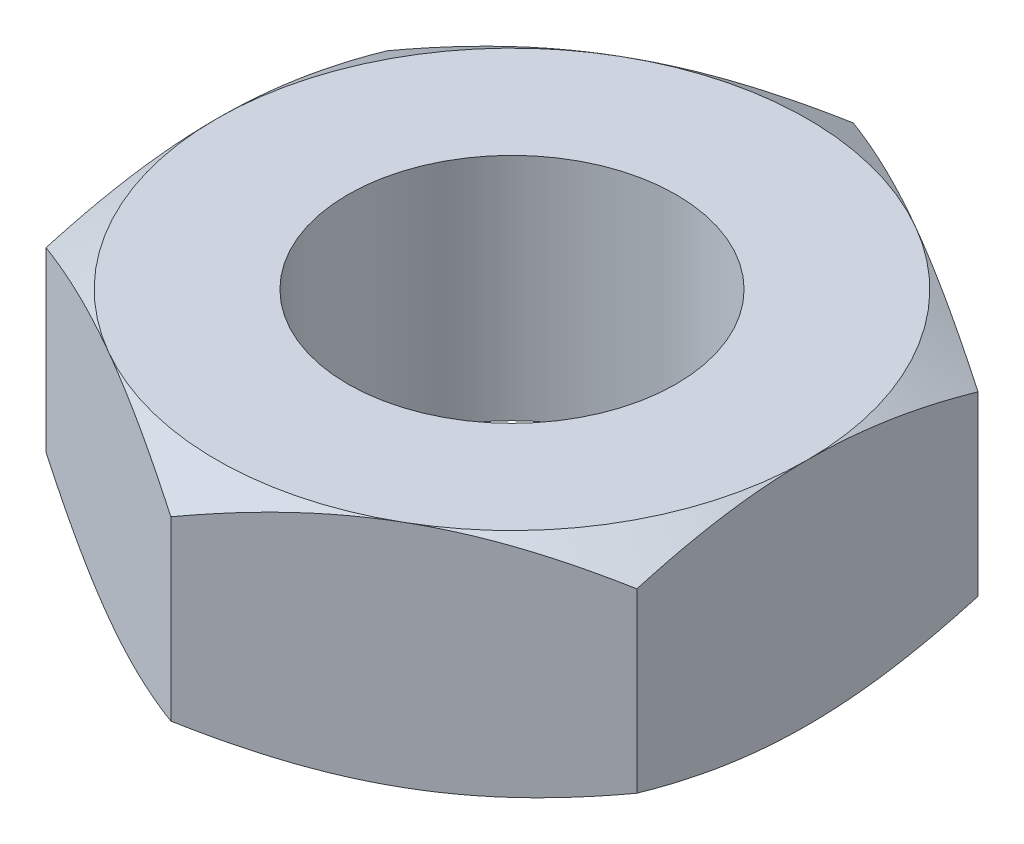
ISO-10303-21;
HEADER;
FILE_DESCRIPTION(('STEP AP214'),'2;1');
FILE_NAME('part.step','',(''),(''),'','','');
FILE_SCHEMA(('AUTOMOTIVE_DESIGN { 1 0 10303 214 1 1 1 1 }'));
ENDSEC;
DATA;
#1=APPLICATION_CONTEXT('core data for automotive mechanical design processes');
#2=APPLICATION_PROTOCOL_DEFINITION('international standard','automotive_design',2000,#1);
#3=PRODUCT_CONTEXT('',#1,'mechanical');
#4=PRODUCT('Part','Part','',(#3));
#5=PRODUCT_RELATED_PRODUCT_CATEGORY('part','',(#4));
#6=PRODUCT_DEFINITION_FORMATION('','',#4);
#7=PRODUCT_DEFINITION_CONTEXT('part definition',#1,'design');
#8=PRODUCT_DEFINITION('design','',#6,#7);
#9=PRODUCT_DEFINITION_SHAPE('','',#8);
#10=(LENGTH_UNIT() NAMED_UNIT(*) SI_UNIT(.MILLI.,.METRE.));
#11=(NAMED_UNIT(*) PLANE_ANGLE_UNIT() SI_UNIT($,.RADIAN.));
#12=(NAMED_UNIT(*) SI_UNIT($,.STERADIAN.) SOLID_ANGLE_UNIT());
#13=UNCERTAINTY_MEASURE_WITH_UNIT(LENGTH_MEASURE(1.E-05),#10,'distance_accuracy_value','');
#14=(GEOMETRIC_REPRESENTATION_CONTEXT(3) GLOBAL_UNCERTAINTY_ASSIGNED_CONTEXT((#13)) GLOBAL_UNIT_ASSIGNED_CONTEXT((#10,
#11,#12)) REPRESENTATION_CONTEXT('',''));
#15=CARTESIAN_POINT('',(0.,0.,0.));
#16=DIRECTION('',(0.,0.,1.));
#17=DIRECTION('',(1.,0.,0.));
#18=AXIS2_PLACEMENT_3D('',#15,#16,#17);
#19=CARTESIAN_POINT('',(0.,0.,0.));
#20=DIRECTION('',(0.,1.,0.));
#21=DIRECTION('',(0.,0.,1.));
#22=AXIS2_PLACEMENT_3D('',#19,#20,#21);
#23=PLANE('',#22);
#24=CARTESIAN_POINT('',(0.,0.,0.));
#25=DIRECTION('',(0.,1.,0.));
#26=DIRECTION('',(0.,0.,1.));
#27=AXIS2_PLACEMENT_3D('',#24,#25,#26);
#28=CIRCLE('',#27,1.25);
#29=CARTESIAN_POINT('',(0.,0.,1.25));
#30=VERTEX_POINT('',#29);
#31=EDGE_CURVE('E277',#30,#30,#28,.T.);
#32=ORIENTED_EDGE('',*,*,#31,.T.);
#33=EDGE_LOOP('',(#32));
#34=FACE_BOUND('',#33,.T.);
#35=CARTESIAN_POINT('',(0.,0.,0.));
#36=DIRECTION('',(0.,1.,0.));
#37=DIRECTION('',(0.,0.,1.));
#38=AXIS2_PLACEMENT_3D('',#35,#36,#37);
#39=CIRCLE('',#38,2.25);
#40=CARTESIAN_POINT('',(1.125,0.,1.94855715851499));
#41=VERTEX_POINT('',#40);
#42=CARTESIAN_POINT('',(-1.125,0.,1.94855715851499));
#43=VERTEX_POINT('',#42);
#44=EDGE_CURVE('E52',#41,#43,#39,.F.);
#45=ORIENTED_EDGE('',*,*,#44,.T.);
#46=CARTESIAN_POINT('',(-2.25,0.,0.));
#47=VERTEX_POINT('',#46);
#48=EDGE_CURVE('E12',#43,#47,#39,.F.);
#49=ORIENTED_EDGE('',*,*,#48,.T.);
#50=CARTESIAN_POINT('',(-1.125,0.,-1.94855715851499));
#51=VERTEX_POINT('',#50);
#52=EDGE_CURVE('E58',#47,#51,#39,.F.);
#53=ORIENTED_EDGE('',*,*,#52,.T.);
#54=CARTESIAN_POINT('',(1.125,0.,-1.94855715851499));
#55=VERTEX_POINT('',#54);
#56=EDGE_CURVE('E398',#51,#55,#39,.F.);
#57=ORIENTED_EDGE('',*,*,#56,.T.);
#58=CARTESIAN_POINT('',(2.25,0.,0.));
#59=VERTEX_POINT('',#58);
#60=EDGE_CURVE('E161',#55,#59,#39,.F.);
#61=ORIENTED_EDGE('',*,*,#60,.T.);
#62=CARTESIAN_POINT('',(0.,0.,0.));
#63=DIRECTION('',(0.,1.,0.));
#64=DIRECTION('',(0.,0.,1.));
#65=AXIS2_PLACEMENT_3D('',#62,#63,#64);
#66=CIRCLE('',#65,2.25);
#67=EDGE_CURVE('E142',#41,#59,#66,.T.);
#68=ORIENTED_EDGE('',*,*,#67,.F.);
#69=EDGE_LOOP('',(#45,#49,#53,#57,#61,#68));
#70=FACE_BOUND('',#69,.T.);
#71=ADVANCED_FACE('F47',(#34,#70),#23,.F.);
#72=CARTESIAN_POINT('',(0.,1.75,0.));
#73=DIRECTION('',(0.,1.,0.));
#74=DIRECTION('',(0.,0.,1.));
#75=AXIS2_PLACEMENT_3D('',#72,#73,#74);
#76=PLANE('',#75);
#77=CARTESIAN_POINT('',(0.,1.75,0.));
#78=DIRECTION('',(0.,1.,0.));
#79=DIRECTION('',(0.,0.,1.));
#80=AXIS2_PLACEMENT_3D('',#77,#78,#79);
#81=CIRCLE('',#80,1.25);
#82=CARTESIAN_POINT('',(0.,1.75,1.25));
#83=VERTEX_POINT('',#82);
#84=EDGE_CURVE('E272',#83,#83,#81,.T.);
#85=ORIENTED_EDGE('',*,*,#84,.F.);
#86=EDGE_LOOP('',(#85));
#87=FACE_BOUND('',#86,.T.);
#88=CARTESIAN_POINT('',(0.,1.75,0.));
#89=DIRECTION('',(0.,1.,0.));
#90=DIRECTION('',(0.,0.,1.));
#91=AXIS2_PLACEMENT_3D('',#88,#89,#90);
#92=CIRCLE('',#91,2.25);
#93=CARTESIAN_POINT('',(-1.125,1.75,1.94855715851499));
#94=VERTEX_POINT('',#93);
#95=CARTESIAN_POINT('',(1.125,1.75,1.94855715851499));
#96=VERTEX_POINT('',#95);
#97=EDGE_CURVE('E334',#94,#96,#92,.T.);
#98=ORIENTED_EDGE('',*,*,#97,.T.);
#99=CARTESIAN_POINT('',(2.25,1.75,0.));
#100=VERTEX_POINT('',#99);
#101=EDGE_CURVE('E337',#96,#100,#92,.T.);
#102=ORIENTED_EDGE('',*,*,#101,.T.);
#103=CARTESIAN_POINT('',(1.125,1.75,-1.94855715851499));
#104=VERTEX_POINT('',#103);
#105=EDGE_CURVE('E349',#100,#104,#92,.T.);
#106=ORIENTED_EDGE('',*,*,#105,.T.);
#107=CARTESIAN_POINT('',(-1.125,1.75,-1.94855715851499));
#108=VERTEX_POINT('',#107);
#109=EDGE_CURVE('E353',#104,#108,#92,.T.);
#110=ORIENTED_EDGE('',*,*,#109,.T.);
#111=CARTESIAN_POINT('',(-2.25,1.75,0.));
#112=VERTEX_POINT('',#111);
#113=EDGE_CURVE('E346',#108,#112,#92,.T.);
#114=ORIENTED_EDGE('',*,*,#113,.T.);
#115=EDGE_CURVE('E339',#112,#94,#92,.T.);
#116=ORIENTED_EDGE('',*,*,#115,.T.);
#117=EDGE_LOOP('',(#98,#102,#106,#110,#114,#116));
#118=FACE_BOUND('',#117,.T.);
#119=ADVANCED_FACE('F315',(#87,#118),#76,.T.);
#120=CARTESIAN_POINT('',(2.25,1.75,-1.29903810567666));
#121=DIRECTION('',(-0.5,0.,0.866025403784439));
#122=DIRECTION('',(0.866025403784439,0.,0.5));
#123=AXIS2_PLACEMENT_3D('',#120,#121,#122);
#124=PLANE('',#123);
#125=DIRECTION('',(0.,-1.,0.));
#126=VECTOR('',#125,1.);
#127=CARTESIAN_POINT('',(2.25,1.75,-1.29903810567666));
#128=LINE('',#127,#126);
#129=CARTESIAN_POINT('',(2.25,1.54903810567666,-1.29903810567667));
#130=VERTEX_POINT('',#129);
#131=CARTESIAN_POINT('',(2.25,0.200961894323341,-1.29903810567666));
#132=VERTEX_POINT('',#131);
#133=EDGE_CURVE('E276',#130,#132,#128,.T.);
#134=ORIENTED_EDGE('',*,*,#133,.T.);
#135=CARTESIAN_POINT('',(2.2502,0.201028565434254,-1.29892263562282));
#136=CARTESIAN_POINT('',(2.15132275118564,0.168055578047864,-1.35600944184252));
#137=CARTESIAN_POINT('',(2.05159200282091,0.138067535415598,-1.41358901625738));
#138=CARTESIAN_POINT('',(1.85040345977937,0.085722388230878,-1.52974527574028));
#139=CARTESIAN_POINT('',(1.74894208949705,0.0633838027064787,-1.58832402518513));
#140=CARTESIAN_POINT('',(1.54727681019892,0.0286095576734189,-1.7047555284741));
#141=CARTESIAN_POINT('',(1.44710393502333,0.0159424738337184,-1.76259036492223));
#142=CARTESIAN_POINT('',(1.24628668739732,0.000818907417419075,-1.87853225689703));
#143=CARTESIAN_POINT('',(1.1456430451668,-0.00165009697600112,-1.93663889083104));
#144=CARTESIAN_POINT('',(0.957574835473434,0.00347837463602968,-2.04522012232352));
#145=CARTESIAN_POINT('',(0.870122156108741,0.00981663451512055,-2.09571095029608));
#146=CARTESIAN_POINT('',(0.695786567891225,0.0299076571898893,-2.19636364908279));
#147=CARTESIAN_POINT('',(0.608904262311711,0.0436672872310839,-2.24652517159694));
#148=CARTESIAN_POINT('',(0.434209045898264,0.0780662653506658,-2.34738550181938));
#149=CARTESIAN_POINT('',(0.346418252564746,0.0988514715826556,-2.39807153998286));
#150=CARTESIAN_POINT('',(0.172146263122404,0.146026087362979,-2.49868751999961));
#151=CARTESIAN_POINT('',(0.0856628332489974,0.172404408014302,-2.54861875151746));
#152=CARTESIAN_POINT('',(-0.000200000000000119,0.201028565434255,-2.59819168140715));
#153=B_SPLINE_CURVE_WITH_KNOTS('',3,(#135,#136,#137,#138,#139,#140,#141,#142,#143,#144,#145,
#146,#147,#148,#149,#150,#151,#152),.UNSPECIFIED.,.F.,.F.,(4,2,2,2,2,2,2,2,4),(0.,
0.356658826016552,0.714175103224236,1.06284241804968,1.41108149062516,1.71433394539794,
2.01786749258222,2.32813511279245,2.63779325460359),.UNSPECIFIED.);
#154=EDGE_CURVE('E71',#132,#55,#153,.T.);
#155=ORIENTED_EDGE('',*,*,#154,.T.);
#156=CARTESIAN_POINT('',(0.,0.200961894323341,-2.59807621135332));
#157=VERTEX_POINT('',#156);
#158=EDGE_CURVE('E206',#55,#157,#153,.T.);
#159=ORIENTED_EDGE('',*,*,#158,.T.);
#160=DIRECTION('',(0.,-1.,0.));
#161=VECTOR('',#160,1.);
#162=CARTESIAN_POINT('',(0.,1.75,-2.59807621135332));
#163=LINE('',#162,#161);
#164=CARTESIAN_POINT('',(0.,1.54903810567666,-2.59807621135332));
#165=VERTEX_POINT('',#164);
#166=EDGE_CURVE('E297',#165,#157,#163,.T.);
#167=ORIENTED_EDGE('',*,*,#166,.F.);
#168=CARTESIAN_POINT('',(2.2502,1.54897143456575,-1.29892263562282));
#169=CARTESIAN_POINT('',(2.15132275118564,1.58194442195214,-1.35600944184252));
#170=CARTESIAN_POINT('',(2.05159200282091,1.6119324645844,-1.41358901625738));
#171=CARTESIAN_POINT('',(1.85040345977937,1.66427761176912,-1.52974527574029));
#172=CARTESIAN_POINT('',(1.74894208949705,1.68661619729352,-1.58832402518513));
#173=CARTESIAN_POINT('',(1.54727681019892,1.72139044232658,-1.7047555284741));
#174=CARTESIAN_POINT('',(1.44710393502333,1.73405752616628,-1.76259036492223));
#175=CARTESIAN_POINT('',(1.24628668739732,1.74918109258258,-1.87853225689703));
#176=CARTESIAN_POINT('',(1.1456430451668,1.751650096976,-1.93663889083104));
#177=CARTESIAN_POINT('',(0.957574835473434,1.74652162536397,-2.04522012232352));
#178=CARTESIAN_POINT('',(0.870122156108741,1.74018336548488,-2.09571095029608));
#179=CARTESIAN_POINT('',(0.695786567891225,1.72009234281011,-2.19636364908279));
#180=CARTESIAN_POINT('',(0.608904262311711,1.70633271276892,-2.24652517159694));
#181=CARTESIAN_POINT('',(0.434209045898264,1.67193373464933,-2.34738550181938));
#182=CARTESIAN_POINT('',(0.346418252564746,1.65114852841734,-2.39807153998286));
#183=CARTESIAN_POINT('',(0.172146263122404,1.60397391263702,-2.49868751999961));
#184=CARTESIAN_POINT('',(0.0856628332489972,1.5775955919857,-2.54861875151746));
#185=CARTESIAN_POINT('',(-0.000200000000000122,1.54897143456575,-2.59819168140715));
#186=B_SPLINE_CURVE_WITH_KNOTS('',3,(#168,#169,#170,#171,#172,#173,#174,#175,#176,#177,#178,
#179,#180,#181,#182,#183,#184,#185),.UNSPECIFIED.,.F.,.F.,(4,2,2,2,2,2,2,2,4),(0.,
0.356658826016552,0.714175103224236,1.06284241804968,1.41108149062516,1.71433394539794,
2.01786749258222,2.32813511279245,2.63779325460359),.UNSPECIFIED.);
#187=EDGE_CURVE('E264',#104,#165,#186,.T.);
#188=ORIENTED_EDGE('',*,*,#187,.F.);
#189=EDGE_CURVE('E271',#130,#104,#186,.T.);
#190=ORIENTED_EDGE('',*,*,#189,.F.);
#191=EDGE_LOOP('',(#134,#155,#159,#167,#188,#190));
#192=FACE_BOUND('',#191,.T.);
#193=ADVANCED_FACE('F49',(#192),#124,.F.);
#194=CARTESIAN_POINT('',(0.,1.75,-2.59807621135332));
#195=DIRECTION('',(0.5,0.,0.866025403784439));
#196=DIRECTION('',(0.866025403784439,0.,-0.5));
#197=AXIS2_PLACEMENT_3D('',#194,#195,#196);
#198=PLANE('',#197);
#199=ORIENTED_EDGE('',*,*,#166,.T.);
#200=CARTESIAN_POINT('',(0.000200000000000053,0.201028565434255,-2.59819168140715));
#201=CARTESIAN_POINT('',(-0.0986772488143574,0.168055578047864,-2.54110487518745));
#202=CARTESIAN_POINT('',(-0.198407997179094,0.138067535415598,-2.48352530077259));
#203=CARTESIAN_POINT('',(-0.399596540220633,0.085722388230878,-2.36736904128969));
#204=CARTESIAN_POINT('',(-0.501057910502945,0.0633838027064787,-2.30879029184485));
#205=CARTESIAN_POINT('',(-0.702723189801079,0.0286095576734188,-2.19235878855587));
#206=CARTESIAN_POINT('',(-0.802896064976672,0.0159424738337182,-2.13452395210774));
#207=CARTESIAN_POINT('',(-1.00371331260268,0.000818907417418789,-2.01858206013295));
#208=CARTESIAN_POINT('',(-1.1043569548332,-0.00165009697600148,-1.96047542619893));
#209=CARTESIAN_POINT('',(-1.29242516452656,0.00347837463602929,-1.85189419470646));
#210=CARTESIAN_POINT('',(-1.37987784389126,0.0098166345151202,-1.8014033667339));
#211=CARTESIAN_POINT('',(-1.55421343210877,0.0299076571898889,-1.70075066794718));
#212=CARTESIAN_POINT('',(-1.64109573768829,0.0436672872310835,-1.65058914543304));
#213=CARTESIAN_POINT('',(-1.81579095410174,0.0780662653506654,-1.54972881521059));
#214=CARTESIAN_POINT('',(-1.90358174743525,0.0988514715826553,-1.49904277704711));
#215=CARTESIAN_POINT('',(-2.07785373687759,0.146026087362979,-1.39842679703037));
#216=CARTESIAN_POINT('',(-2.164337166751,0.172404408014302,-1.34849556551251));
#217=CARTESIAN_POINT('',(-2.2502,0.201028565434254,-1.29892263562282));
#218=B_SPLINE_CURVE_WITH_KNOTS('',3,(#200,#201,#202,#203,#204,#205,#206,#207,#208,#209,#210,
#211,#212,#213,#214,#215,#216,#217),.UNSPECIFIED.,.F.,.F.,(4,2,2,2,2,2,2,2,4),(0.,
0.356658826016552,0.714175103224236,1.06284241804968,1.41108149062516,1.71433394539794,
2.01786749258222,2.32813511279245,2.63779325460359),.UNSPECIFIED.);
#219=EDGE_CURVE('E404',#157,#51,#218,.T.);
#220=ORIENTED_EDGE('',*,*,#219,.T.);
#221=CARTESIAN_POINT('',(-2.25,0.200961894323341,-1.29903810567666));
#222=VERTEX_POINT('',#221);
#223=EDGE_CURVE('E225',#51,#222,#218,.T.);
#224=ORIENTED_EDGE('',*,*,#223,.T.);
#225=DIRECTION('',(0.,-1.,0.));
#226=VECTOR('',#225,1.);
#227=CARTESIAN_POINT('',(-2.25,1.75,-1.29903810567666));
#228=LINE('',#227,#226);
#229=CARTESIAN_POINT('',(-2.25,1.54903810567666,-1.29903810567666));
#230=VERTEX_POINT('',#229);
#231=EDGE_CURVE('E293',#230,#222,#228,.T.);
#232=ORIENTED_EDGE('',*,*,#231,.F.);
#233=CARTESIAN_POINT('',(0.000200000000000038,1.54897143456575,-2.59819168140715));
#234=CARTESIAN_POINT('',(-0.0986772488143574,1.58194442195214,-2.54110487518746));
#235=CARTESIAN_POINT('',(-0.198407997179094,1.6119324645844,-2.48352530077259));
#236=CARTESIAN_POINT('',(-0.399596540220633,1.66427761176912,-2.36736904128969));
#237=CARTESIAN_POINT('',(-0.501057910502945,1.68661619729352,-2.30879029184485));
#238=CARTESIAN_POINT('',(-0.702723189801079,1.72139044232658,-2.19235878855587));
#239=CARTESIAN_POINT('',(-0.802896064976672,1.73405752616628,-2.13452395210774));
#240=CARTESIAN_POINT('',(-1.00371331260268,1.74918109258258,-2.01858206013295));
#241=CARTESIAN_POINT('',(-1.1043569548332,1.751650096976,-1.96047542619893));
#242=CARTESIAN_POINT('',(-1.29242516452656,1.74652162536397,-1.85189419470646));
#243=CARTESIAN_POINT('',(-1.37987784389126,1.74018336548488,-1.8014033667339));
#244=CARTESIAN_POINT('',(-1.55421343210877,1.72009234281011,-1.70075066794718));
#245=CARTESIAN_POINT('',(-1.64109573768829,1.70633271276892,-1.65058914543304));
#246=CARTESIAN_POINT('',(-1.81579095410174,1.67193373464933,-1.54972881521059));
#247=CARTESIAN_POINT('',(-1.90358174743525,1.65114852841734,-1.49904277704711));
#248=CARTESIAN_POINT('',(-2.07785373687759,1.60397391263702,-1.39842679703037));
#249=CARTESIAN_POINT('',(-2.164337166751,1.5775955919857,-1.34849556551251));
#250=CARTESIAN_POINT('',(-2.2502,1.54897143456575,-1.29892263562282));
#251=B_SPLINE_CURVE_WITH_KNOTS('',3,(#233,#234,#235,#236,#237,#238,#239,#240,#241,#242,#243,
#244,#245,#246,#247,#248,#249,#250),.UNSPECIFIED.,.F.,.F.,(4,2,2,2,2,2,2,2,4),(0.,
0.356658826016552,0.714175103224236,1.06284241804968,1.41108149062516,1.71433394539794,
2.01786749258222,2.32813511279245,2.63779325460359),.UNSPECIFIED.);
#252=EDGE_CURVE('E256',#108,#230,#251,.T.);
#253=ORIENTED_EDGE('',*,*,#252,.F.);
#254=EDGE_CURVE('E263',#165,#108,#251,.T.);
#255=ORIENTED_EDGE('',*,*,#254,.F.);
#256=EDGE_LOOP('',(#199,#220,#224,#232,#253,#255));
#257=FACE_BOUND('',#256,.T.);
#258=ADVANCED_FACE('F234',(#257),#198,.F.);
#259=CARTESIAN_POINT('',(-2.25,1.75,-1.29903810567666));
#260=DIRECTION('',(1.,0.,0.));
#261=DIRECTION('',(0.,0.,-1.));
#262=AXIS2_PLACEMENT_3D('',#259,#260,#261);
#263=PLANE('',#262);
#264=ORIENTED_EDGE('',*,*,#231,.T.);
#265=CARTESIAN_POINT('',(-2.25,1.57049861982334,-4.43172912721208));
#266=CARTESIAN_POINT('',(-2.25,1.51735693759208,-4.32848794492226));
#267=CARTESIAN_POINT('',(-2.25,1.46450484743296,-4.22509639331572));
#268=CARTESIAN_POINT('',(-2.25,1.35952530789621,-4.01794384416323));
#269=CARTESIAN_POINT('',(-2.25,1.30739787204856,-3.91418283976455));
#270=CARTESIAN_POINT('',(-2.25,1.20393081844307,-3.70605700815303));
#271=CARTESIAN_POINT('',(-2.25,1.1525926236047,-3.60169147231438));
#272=CARTESIAN_POINT('',(-2.25,1.05099117669964,-3.39243582155596));
#273=CARTESIAN_POINT('',(-2.25,1.000727939927,-3.28754569919877));
#274=CARTESIAN_POINT('',(-2.25,0.898925995293034,-3.07160047020285));
#275=CARTESIAN_POINT('',(-2.25,0.847459290612845,-2.96051132352861));
#276=CARTESIAN_POINT('',(-2.25,0.746406212005017,-2.73748183196732));
#277=CARTESIAN_POINT('',(-2.25,0.696819787356086,-2.62554151013899));
#278=CARTESIAN_POINT('',(-2.25,0.600100967453589,-2.40069008962636));
#279=CARTESIAN_POINT('',(-2.25,0.552966929054416,-2.28777970157739));
#280=CARTESIAN_POINT('',(-2.25,0.461846511068629,-2.06065851247683));
#281=CARTESIAN_POINT('',(-2.25,0.417860865336628,-1.94644741538902));
#282=CARTESIAN_POINT('',(-2.25,0.32729368556671,-1.69797138865069));
#283=CARTESIAN_POINT('',(-2.25,0.28143501613463,-1.56343919862733));
#284=CARTESIAN_POINT('',(-2.25,0.197475070529799,-1.29200018214826));
#285=CARTESIAN_POINT('',(-2.25,0.159369866726331,-1.15509459630545));
#286=CARTESIAN_POINT('',(-2.25,0.0942889667848675,-0.881369269399069));
#287=CARTESIAN_POINT('',(-2.25,0.0671140468085098,-0.74459812693742));
#288=CARTESIAN_POINT('',(-2.25,0.0257222330991208,-0.46908644568122));
#289=CARTESIAN_POINT('',(-2.25,0.0114977452462127,-0.3303471095752));
#290=CARTESIAN_POINT('',(-2.25,0.00123269639131357,-0.120784370517542));
#291=CARTESIAN_POINT('',(-2.25,-0.000315601094854738,-0.0502039746349318));
#292=CARTESIAN_POINT('',(-2.25,0.000422033997696976,0.0909367469657726));
#293=CARTESIAN_POINT('',(-2.25,0.00270796730213806,0.161497072680065));
#294=CARTESIAN_POINT('',(-2.25,0.0152377813490387,0.37286438362323));
#295=CARTESIAN_POINT('',(-2.25,0.031153514657774,0.513361084144873));
#296=CARTESIAN_POINT('',(-2.25,0.0764279690031744,0.794982413158732));
#297=CARTESIAN_POINT('',(-2.25,0.106052731323689,0.936062007316042));
#298=CARTESIAN_POINT('',(-2.25,0.175669429631058,1.21561548141805));
#299=CARTESIAN_POINT('',(-2.25,0.215664560549491,1.35408854420889));
#300=CARTESIAN_POINT('',(-2.25,0.301433813240795,1.62298376559588));
#301=CARTESIAN_POINT('',(-2.25,0.34690627294026,1.75350414338493));
#302=CARTESIAN_POINT('',(-2.25,0.442941824020628,2.01267340913791));
#303=CARTESIAN_POINT('',(-2.25,0.493506146306572,2.14132183593333));
#304=CARTESIAN_POINT('',(-2.25,0.598415917250672,2.3972089614727));
#305=CARTESIAN_POINT('',(-2.25,0.652765191067168,2.5244460788882));
#306=CARTESIAN_POINT('',(-2.25,0.764244038829299,2.77769813848635));
#307=CARTESIAN_POINT('',(-2.25,0.821373763792894,2.9037130138371));
#308=CARTESIAN_POINT('',(-2.25,0.934436062749625,3.1476496239965));
#309=CARTESIAN_POINT('',(-2.25,0.990252927298656,3.26562520727676));
#310=CARTESIAN_POINT('',(-2.25,1.10334942732948,3.50087634814471));
#311=CARTESIAN_POINT('',(-2.25,1.16062911044141,3.61815188278466));
#312=CARTESIAN_POINT('',(-2.25,1.27615326827056,3.85174791850404));
#313=CARTESIAN_POINT('',(-2.25,1.3343939714757,3.96807028911018));
#314=CARTESIAN_POINT('',(-2.25,1.45180296105985,4.20023381118101));
#315=CARTESIAN_POINT('',(-2.25,1.51097116762094,4.31607500298083));
#316=CARTESIAN_POINT('',(-2.25,1.57049861982334,4.43172912721207));
#317=B_SPLINE_CURVE_WITH_KNOTS('',3,(#265,#266,#267,#268,#269,#270,#271,#272,#273,#274,#275,
#276,#277,#278,#279,#280,#281,#282,#283,#284,#285,#286,#287,#288,#289,#290,#291,#292,#293,#294,
#295,#296,#297,#298,#299,#300,#301,#302,#303,#304,#305,#306,#307,#308,#309,#310,#311,#312,#313,
#314,#315,#316),.UNSPECIFIED.,.F.,.F.,(4,2,2,2,2,2,2,2,2,2,2,2,2,2,2,2,2,2,2,2,2,2,2,2,2,4),(0.,
0.348347395383933,0.696701286027883,1.04562309484171,1.39454986466947,1.76183249981756,
2.12910522031385,2.49612860556298,2.86323726307789,3.2894710608127,3.71548840311863,
4.13334452619794,4.55095546076511,4.7626532574073,4.97435109411843,5.39773666667532,
5.82970728415092,6.26181114277156,6.67631854142574,7.09092638459783,7.50595949709433,
7.9210151769911,8.31254332110152,8.70408422986847,9.09434358465051,9.4845695373743),.UNSPECIFIED.);
#318=EDGE_CURVE('E224',#222,#47,#317,.T.);
#319=ORIENTED_EDGE('',*,*,#318,.T.);
#320=CARTESIAN_POINT('',(-2.25,0.20096189432334,1.29903810567666));
#321=VERTEX_POINT('',#320);
#322=EDGE_CURVE('E216',#47,#321,#317,.T.);
#323=ORIENTED_EDGE('',*,*,#322,.T.);
#324=DIRECTION('',(0.,-1.,0.));
#325=VECTOR('',#324,1.);
#326=CARTESIAN_POINT('',(-2.25,1.75,1.29903810567666));
#327=LINE('',#326,#325);
#328=CARTESIAN_POINT('',(-2.25,1.54903810567666,1.29903810567666));
#329=VERTEX_POINT('',#328);
#330=EDGE_CURVE('E289',#329,#321,#327,.T.);
#331=ORIENTED_EDGE('',*,*,#330,.F.);
#332=CARTESIAN_POINT('',(-2.25,0.17950138017666,-4.43172912721208));
#333=CARTESIAN_POINT('',(-2.25,0.232643062407916,-4.32848794492226));
#334=CARTESIAN_POINT('',(-2.25,0.285495152567039,-4.22509639331572));
#335=CARTESIAN_POINT('',(-2.25,0.390474692103788,-4.01794384416323));
#336=CARTESIAN_POINT('',(-2.25,0.442602127951439,-3.91418283976455));
#337=CARTESIAN_POINT('',(-2.25,0.546069181556928,-3.70605700815303));
#338=CARTESIAN_POINT('',(-2.25,0.597407376395302,-3.60169147231438));
#339=CARTESIAN_POINT('',(-2.25,0.699008823300362,-3.39243582155596));
#340=CARTESIAN_POINT('',(-2.25,0.749272060072999,-3.28754569919877));
#341=CARTESIAN_POINT('',(-2.25,0.851074004706966,-3.07160047020285));
#342=CARTESIAN_POINT('',(-2.25,0.902540709387155,-2.96051132352861));
#343=CARTESIAN_POINT('',(-2.25,1.00359378799498,-2.73748183196732));
#344=CARTESIAN_POINT('',(-2.25,1.05318021264391,-2.62554151013899));
#345=CARTESIAN_POINT('',(-2.25,1.14989903254641,-2.40069008962636));
#346=CARTESIAN_POINT('',(-2.25,1.19703307094558,-2.28777970157739));
#347=CARTESIAN_POINT('',(-2.25,1.28815348893137,-2.06065851247683));
#348=CARTESIAN_POINT('',(-2.25,1.33213913466337,-1.94644741538902));
#349=CARTESIAN_POINT('',(-2.25,1.42270631443329,-1.69797138865069));
#350=CARTESIAN_POINT('',(-2.25,1.46856498386537,-1.56343919862733));
#351=CARTESIAN_POINT('',(-2.25,1.5525249294702,-1.29200018214826));
#352=CARTESIAN_POINT('',(-2.25,1.59063013327367,-1.15509459630545));
#353=CARTESIAN_POINT('',(-2.25,1.65571103321513,-0.881369269399069));
#354=CARTESIAN_POINT('',(-2.25,1.68288595319149,-0.744598126937421));
#355=CARTESIAN_POINT('',(-2.25,1.72427776690088,-0.469086445681221));
#356=CARTESIAN_POINT('',(-2.25,1.73850225475379,-0.3303471095752));
#357=CARTESIAN_POINT('',(-2.25,1.74876730360869,-0.120784370517543));
#358=CARTESIAN_POINT('',(-2.25,1.75031560109485,-0.0502039746349324));
#359=CARTESIAN_POINT('',(-2.25,1.7495779660023,0.090936746965772));
#360=CARTESIAN_POINT('',(-2.25,1.74729203269786,0.161497072680065));
#361=CARTESIAN_POINT('',(-2.25,1.73476221865096,0.37286438362323));
#362=CARTESIAN_POINT('',(-2.25,1.71884648534223,0.513361084144873));
#363=CARTESIAN_POINT('',(-2.25,1.67357203099683,0.794982413158732));
#364=CARTESIAN_POINT('',(-2.25,1.64394726867631,0.936062007316042));
#365=CARTESIAN_POINT('',(-2.25,1.57433057036894,1.21561548141805));
#366=CARTESIAN_POINT('',(-2.25,1.53433543945051,1.35408854420889));
#367=CARTESIAN_POINT('',(-2.25,1.44856618675921,1.62298376559588));
#368=CARTESIAN_POINT('',(-2.25,1.40309372705974,1.75350414338493));
#369=CARTESIAN_POINT('',(-2.25,1.30705817597937,2.01267340913791));
#370=CARTESIAN_POINT('',(-2.25,1.25649385369343,2.14132183593333));
#371=CARTESIAN_POINT('',(-2.25,1.15158408274933,2.3972089614727));
#372=CARTESIAN_POINT('',(-2.25,1.09723480893283,2.5244460788882));
#373=CARTESIAN_POINT('',(-2.25,0.985755961170701,2.77769813848635));
#374=CARTESIAN_POINT('',(-2.25,0.928626236207107,2.9037130138371));
#375=CARTESIAN_POINT('',(-2.25,0.815563937250375,3.1476496239965));
#376=CARTESIAN_POINT('',(-2.25,0.759747072701344,3.26562520727676));
#377=CARTESIAN_POINT('',(-2.25,0.646650572670523,3.50087634814471));
#378=CARTESIAN_POINT('',(-2.25,0.589370889558594,3.61815188278466));
#379=CARTESIAN_POINT('',(-2.25,0.473846731729442,3.85174791850404));
#380=CARTESIAN_POINT('',(-2.25,0.415606028524301,3.96807028911018));
#381=CARTESIAN_POINT('',(-2.25,0.298197038940152,4.20023381118101));
#382=CARTESIAN_POINT('',(-2.25,0.239028832379064,4.31607500298083));
#383=CARTESIAN_POINT('',(-2.25,0.17950138017666,4.43172912721207));
#384=B_SPLINE_CURVE_WITH_KNOTS('',3,(#332,#333,#334,#335,#336,#337,#338,#339,#340,#341,#342,
#343,#344,#345,#346,#347,#348,#349,#350,#351,#352,#353,#354,#355,#356,#357,#358,#359,#360,#361,
#362,#363,#364,#365,#366,#367,#368,#369,#370,#371,#372,#373,#374,#375,#376,#377,#378,#379,#380,
#381,#382,#383),.UNSPECIFIED.,.F.,.F.,(4,2,2,2,2,2,2,2,2,2,2,2,2,2,2,2,2,2,2,2,2,2,2,2,2,4),(0.,
0.348347395383933,0.696701286027883,1.04562309484171,1.39454986466947,1.76183249981756,
2.12910522031385,2.49612860556298,2.86323726307789,3.2894710608127,3.71548840311863,
4.13334452619794,4.55095546076511,4.7626532574073,4.97435109411843,5.39773666667532,
5.82970728415092,6.26181114277156,6.67631854142574,7.09092638459783,7.50595949709433,
7.9210151769911,8.31254332110152,8.70408422986847,9.09434358465051,9.4845695373743),.UNSPECIFIED.);
#385=EDGE_CURVE('E240',#112,#329,#384,.T.);
#386=ORIENTED_EDGE('',*,*,#385,.F.);
#387=EDGE_CURVE('E248',#230,#112,#384,.T.);
#388=ORIENTED_EDGE('',*,*,#387,.F.);
#389=EDGE_LOOP('',(#264,#319,#323,#331,#386,#388));
#390=FACE_BOUND('',#389,.T.);
#391=ADVANCED_FACE('F230',(#390),#263,.F.);
#392=CARTESIAN_POINT('',(-2.25,1.75,1.29903810567666));
#393=DIRECTION('',(0.5,0.,-0.866025403784439));
#394=DIRECTION('',(-0.866025403784439,0.,-0.5));
#395=AXIS2_PLACEMENT_3D('',#392,#393,#394);
#396=PLANE('',#395);
#397=ORIENTED_EDGE('',*,*,#330,.T.);
#398=CARTESIAN_POINT('',(-2.2502,0.201028565434254,1.29892263562282));
#399=CARTESIAN_POINT('',(-2.15132275118564,0.168055578047863,1.35600944184252));
#400=CARTESIAN_POINT('',(-2.05159200282091,0.138067535415598,1.41358901625738));
#401=CARTESIAN_POINT('',(-1.85040345977937,0.0857223882308776,1.52974527574028));
#402=CARTESIAN_POINT('',(-1.74894208949705,0.0633838027064783,1.58832402518512));
#403=CARTESIAN_POINT('',(-1.54727681019892,0.0286095576734184,1.7047555284741));
#404=CARTESIAN_POINT('',(-1.44710393502333,0.0159424738337179,1.76259036492223));
#405=CARTESIAN_POINT('',(-1.24628668739732,0.000818907417418356,1.87853225689702));
#406=CARTESIAN_POINT('',(-1.1456430451668,-0.00165009697600204,1.93663889083104));
#407=CARTESIAN_POINT('',(-0.957574835473434,0.00347837463602872,2.04522012232352));
#408=CARTESIAN_POINT('',(-0.870122156108741,0.00981663451511971,2.09571095029608));
#409=CARTESIAN_POINT('',(-0.695786567891225,0.0299076571898885,2.19636364908279));
#410=CARTESIAN_POINT('',(-0.608904262311711,0.0436672872310832,2.24652517159694));
#411=CARTESIAN_POINT('',(-0.434209045898263,0.0780662653506651,2.34738550181938));
#412=CARTESIAN_POINT('',(-0.346418252564746,0.098851471582655,2.39807153998286));
#413=CARTESIAN_POINT('',(-0.172146263122404,0.146026087362979,2.49868751999961));
#414=CARTESIAN_POINT('',(-0.0856628332489966,0.172404408014301,2.54861875151746));
#415=CARTESIAN_POINT('',(0.00020000000000111,0.201028565434254,2.59819168140715));
#416=B_SPLINE_CURVE_WITH_KNOTS('',3,(#398,#399,#400,#401,#402,#403,#404,#405,#406,#407,#408,
#409,#410,#411,#412,#413,#414,#415),.UNSPECIFIED.,.F.,.F.,(4,2,2,2,2,2,2,2,4),(0.,
0.356658826016552,0.714175103224236,1.06284241804968,1.41108149062516,1.71433394539794,
2.01786749258222,2.32813511279245,2.63779325460359),.UNSPECIFIED.);
#417=EDGE_CURVE('E174',#321,#43,#416,.T.);
#418=ORIENTED_EDGE('',*,*,#417,.T.);
#419=CARTESIAN_POINT('',(0.,0.20096189432334,2.59807621135332));
#420=VERTEX_POINT('',#419);
#421=EDGE_CURVE('E157',#43,#420,#416,.T.);
#422=ORIENTED_EDGE('',*,*,#421,.T.);
#423=DIRECTION('',(0.,-1.,0.));
#424=VECTOR('',#423,1.);
#425=CARTESIAN_POINT('',(0.,1.75,2.59807621135332));
#426=LINE('',#425,#424);
#427=CARTESIAN_POINT('',(0.,1.54903810567666,2.59807621135332));
#428=VERTEX_POINT('',#427);
#429=EDGE_CURVE('E171',#428,#420,#426,.T.);
#430=ORIENTED_EDGE('',*,*,#429,.F.);
#431=CARTESIAN_POINT('',(-2.2502,1.54897143456575,1.29892263562282));
#432=CARTESIAN_POINT('',(-2.15132275118564,1.58194442195214,1.35600944184252));
#433=CARTESIAN_POINT('',(-2.05159200282091,1.6119324645844,1.41358901625738));
#434=CARTESIAN_POINT('',(-1.85040345977937,1.66427761176912,1.52974527574028));
#435=CARTESIAN_POINT('',(-1.74894208949705,1.68661619729352,1.58832402518512));
#436=CARTESIAN_POINT('',(-1.54727681019892,1.72139044232658,1.7047555284741));
#437=CARTESIAN_POINT('',(-1.44710393502333,1.73405752616628,1.76259036492223));
#438=CARTESIAN_POINT('',(-1.24628668739732,1.74918109258258,1.87853225689702));
#439=CARTESIAN_POINT('',(-1.1456430451668,1.751650096976,1.93663889083104));
#440=CARTESIAN_POINT('',(-0.957574835473434,1.74652162536397,2.04522012232352));
#441=CARTESIAN_POINT('',(-0.870122156108741,1.74018336548488,2.09571095029608));
#442=CARTESIAN_POINT('',(-0.695786567891225,1.72009234281011,2.19636364908279));
#443=CARTESIAN_POINT('',(-0.608904262311711,1.70633271276892,2.24652517159694));
#444=CARTESIAN_POINT('',(-0.434209045898263,1.67193373464934,2.34738550181938));
#445=CARTESIAN_POINT('',(-0.346418252564746,1.65114852841735,2.39807153998286));
#446=CARTESIAN_POINT('',(-0.172146263122404,1.60397391263702,2.49868751999961));
#447=CARTESIAN_POINT('',(-0.0856628332489969,1.5775955919857,2.54861875151746));
#448=CARTESIAN_POINT('',(0.000200000000001108,1.54897143456575,2.59819168140715));
#449=B_SPLINE_CURVE_WITH_KNOTS('',3,(#431,#432,#433,#434,#435,#436,#437,#438,#439,#440,#441,
#442,#443,#444,#445,#446,#447,#448),.UNSPECIFIED.,.F.,.F.,(4,2,2,2,2,2,2,2,4),(0.,
0.356658826016552,0.714175103224236,1.06284241804968,1.41108149062516,1.71433394539794,
2.01786749258222,2.32813511279245,2.63779325460359),.UNSPECIFIED.);
#450=EDGE_CURVE('E250',#94,#428,#449,.T.);
#451=ORIENTED_EDGE('',*,*,#450,.F.);
#452=EDGE_CURVE('E249',#329,#94,#449,.T.);
#453=ORIENTED_EDGE('',*,*,#452,.F.);
#454=EDGE_LOOP('',(#397,#418,#422,#430,#451,#453));
#455=FACE_BOUND('',#454,.T.);
#456=ADVANCED_FACE('F233',(#455),#396,.F.);
#457=CARTESIAN_POINT('',(0.,1.75,2.59807621135332));
#458=DIRECTION('',(-0.5,0.,-0.866025403784439));
#459=DIRECTION('',(-0.866025403784439,0.,0.5));
#460=AXIS2_PLACEMENT_3D('',#457,#458,#459);
#461=PLANE('',#460);
#462=ORIENTED_EDGE('',*,*,#429,.T.);
#463=CARTESIAN_POINT('',(-0.000199999999999119,0.201028565434254,2.59819168140715));
#464=CARTESIAN_POINT('',(0.0986772488143582,0.168055578047863,2.54110487518745));
#465=CARTESIAN_POINT('',(0.198407997179094,0.138067535415598,2.48352530077259));
#466=CARTESIAN_POINT('',(0.399596540220634,0.0857223882308776,2.36736904128969));
#467=CARTESIAN_POINT('',(0.501057910502946,0.0633838027064782,2.30879029184485));
#468=CARTESIAN_POINT('',(0.702723189801079,0.0286095576734185,2.19235878855587));
#469=CARTESIAN_POINT('',(0.802896064976673,0.0159424738337181,2.13452395210774));
#470=CARTESIAN_POINT('',(1.00371331260268,0.000818907417418777,2.01858206013295));
#471=CARTESIAN_POINT('',(1.1043569548332,-0.00165009697600161,1.96047542619893));
#472=CARTESIAN_POINT('',(1.29242516452657,0.00347837463602917,1.85189419470646));
#473=CARTESIAN_POINT('',(1.37987784389126,0.00981663451512018,1.8014033667339));
#474=CARTESIAN_POINT('',(1.55421343210877,0.0299076571898889,1.70075066794718));
#475=CARTESIAN_POINT('',(1.64109573768829,0.0436672872310834,1.65058914543304));
#476=CARTESIAN_POINT('',(1.81579095410174,0.0780662653506653,1.54972881521059));
#477=CARTESIAN_POINT('',(1.90358174743525,0.0988514715826554,1.49904277704711));
#478=CARTESIAN_POINT('',(2.07785373687759,0.146026087362979,1.39842679703037));
#479=CARTESIAN_POINT('',(2.164337166751,0.172404408014302,1.34849556551251));
#480=CARTESIAN_POINT('',(2.2502,0.201028565434254,1.29892263562282));
#481=B_SPLINE_CURVE_WITH_KNOTS('',3,(#463,#464,#465,#466,#467,#468,#469,#470,#471,#472,#473,
#474,#475,#476,#477,#478,#479,#480),.UNSPECIFIED.,.F.,.F.,(4,2,2,2,2,2,2,2,4),(0.,
0.356658826016552,0.714175103224236,1.06284241804968,1.41108149062516,1.71433394539794,
2.01786749258222,2.32813511279245,2.63779325460359),.UNSPECIFIED.);
#482=EDGE_CURVE('E151',#420,#41,#481,.T.);
#483=ORIENTED_EDGE('',*,*,#482,.T.);
#484=CARTESIAN_POINT('',(2.25,0.200961894323341,1.29903810567666));
#485=VERTEX_POINT('',#484);
#486=EDGE_CURVE('E138',#41,#485,#481,.T.);
#487=ORIENTED_EDGE('',*,*,#486,.T.);
#488=DIRECTION('',(0.,-1.,0.));
#489=VECTOR('',#488,1.);
#490=CARTESIAN_POINT('',(2.25,1.75,1.29903810567666));
#491=LINE('',#490,#489);
#492=CARTESIAN_POINT('',(2.25,1.54903810567666,1.29903810567666));
#493=VERTEX_POINT('',#492);
#494=EDGE_CURVE('E284',#493,#485,#491,.T.);
#495=ORIENTED_EDGE('',*,*,#494,.F.);
#496=CARTESIAN_POINT('',(-0.000199999999999119,1.54897143456575,2.59819168140715));
#497=CARTESIAN_POINT('',(0.098677248814358,1.58194442195214,2.54110487518745));
#498=CARTESIAN_POINT('',(0.198407997179094,1.6119324645844,2.48352530077259));
#499=CARTESIAN_POINT('',(0.399596540220633,1.66427761176912,2.36736904128969));
#500=CARTESIAN_POINT('',(0.501057910502946,1.68661619729352,2.30879029184485));
#501=CARTESIAN_POINT('',(0.702723189801079,1.72139044232658,2.19235878855587));
#502=CARTESIAN_POINT('',(0.802896064976673,1.73405752616628,2.13452395210774));
#503=CARTESIAN_POINT('',(1.00371331260268,1.74918109258258,2.01858206013295));
#504=CARTESIAN_POINT('',(1.1043569548332,1.751650096976,1.96047542619893));
#505=CARTESIAN_POINT('',(1.29242516452657,1.74652162536397,1.85189419470646));
#506=CARTESIAN_POINT('',(1.37987784389126,1.74018336548488,1.8014033667339));
#507=CARTESIAN_POINT('',(1.55421343210877,1.72009234281011,1.70075066794718));
#508=CARTESIAN_POINT('',(1.64109573768829,1.70633271276892,1.65058914543304));
#509=CARTESIAN_POINT('',(1.81579095410174,1.67193373464933,1.54972881521059));
#510=CARTESIAN_POINT('',(1.90358174743525,1.65114852841734,1.49904277704711));
#511=CARTESIAN_POINT('',(2.0778537368776,1.60397391263702,1.39842679703037));
#512=CARTESIAN_POINT('',(2.164337166751,1.5775955919857,1.34849556551251));
#513=CARTESIAN_POINT('',(2.2502,1.54897143456575,1.29892263562282));
#514=B_SPLINE_CURVE_WITH_KNOTS('',3,(#496,#497,#498,#499,#500,#501,#502,#503,#504,#505,#506,
#507,#508,#509,#510,#511,#512,#513),.UNSPECIFIED.,.F.,.F.,(4,2,2,2,2,2,2,2,4),(0.,
0.356658826016552,0.714175103224236,1.06284241804968,1.41108149062515,1.71433394539794,
2.01786749258222,2.32813511279245,2.63779325460359),.UNSPECIFIED.);
#515=EDGE_CURVE('E348',#96,#493,#514,.T.);
#516=ORIENTED_EDGE('',*,*,#515,.F.);
#517=EDGE_CURVE('E352',#428,#96,#514,.T.);
#518=ORIENTED_EDGE('',*,*,#517,.F.);
#519=EDGE_LOOP('',(#462,#483,#487,#495,#516,#518));
#520=FACE_BOUND('',#519,.T.);
#521=ADVANCED_FACE('F168',(#520),#461,.F.);
#522=CARTESIAN_POINT('',(2.25,1.75,1.29903810567666));
#523=DIRECTION('',(-1.,0.,0.));
#524=DIRECTION('',(0.,0.,1.));
#525=AXIS2_PLACEMENT_3D('',#522,#523,#524);
#526=PLANE('',#525);
#527=ORIENTED_EDGE('',*,*,#494,.T.);
#528=CARTESIAN_POINT('',(2.25,1.57049861982334,4.43172912721208));
#529=CARTESIAN_POINT('',(2.25,1.51735693759209,4.32848794492226));
#530=CARTESIAN_POINT('',(2.25,1.46450484743296,4.22509639331572));
#531=CARTESIAN_POINT('',(2.25,1.35952530789621,4.01794384416323));
#532=CARTESIAN_POINT('',(2.25,1.30739787204856,3.91418283976455));
#533=CARTESIAN_POINT('',(2.25,1.20393081844307,3.70605700815303));
#534=CARTESIAN_POINT('',(2.25,1.1525926236047,3.60169147231438));
#535=CARTESIAN_POINT('',(2.25,1.05099117669964,3.39243582155597));
#536=CARTESIAN_POINT('',(2.25,1.000727939927,3.28754569919877));
#537=CARTESIAN_POINT('',(2.25,0.898925995293034,3.07160047020285));
#538=CARTESIAN_POINT('',(2.25,0.847459290612845,2.96051132352861));
#539=CARTESIAN_POINT('',(2.25,0.746406212005017,2.73748183196732));
#540=CARTESIAN_POINT('',(2.25,0.696819787356086,2.62554151013899));
#541=CARTESIAN_POINT('',(2.25,0.600100967453589,2.40069008962636));
#542=CARTESIAN_POINT('',(2.25,0.552966929054416,2.28777970157739));
#543=CARTESIAN_POINT('',(2.25,0.461846511068629,2.06065851247683));
#544=CARTESIAN_POINT('',(2.25,0.417860865336628,1.94644741538902));
#545=CARTESIAN_POINT('',(2.25,0.32729368556671,1.69797138865069));
#546=CARTESIAN_POINT('',(2.25,0.281435016134631,1.56343919862733));
#547=CARTESIAN_POINT('',(2.25,0.197475070529799,1.29200018214826));
#548=CARTESIAN_POINT('',(2.25,0.159369866726331,1.15509459630545));
#549=CARTESIAN_POINT('',(2.25,0.0942889667848678,0.88136926939907));
#550=CARTESIAN_POINT('',(2.25,0.0671140468085098,0.744598126937421));
#551=CARTESIAN_POINT('',(2.25,0.0257222330991207,0.469086445681221));
#552=CARTESIAN_POINT('',(2.25,0.0114977452462127,0.330347109575201));
#553=CARTESIAN_POINT('',(2.25,0.00123269639131359,0.120784370517543));
#554=CARTESIAN_POINT('',(2.25,-0.000315601094854728,0.0502039746349325));
#555=CARTESIAN_POINT('',(2.25,0.000422033997696968,-0.0909367469657723));
#556=CARTESIAN_POINT('',(2.25,0.00270796730213806,-0.161497072680065));
#557=CARTESIAN_POINT('',(2.25,0.0152377813490387,-0.37286438362323));
#558=CARTESIAN_POINT('',(2.25,0.0311535146577739,-0.513361084144872));
#559=CARTESIAN_POINT('',(2.25,0.0764279690031742,-0.794982413158731));
#560=CARTESIAN_POINT('',(2.25,0.106052731323689,-0.936062007316042));
#561=CARTESIAN_POINT('',(2.25,0.175669429631058,-1.21561548141805));
#562=CARTESIAN_POINT('',(2.25,0.215664560549491,-1.35408854420889));
#563=CARTESIAN_POINT('',(2.25,0.301433813240795,-1.62298376559588));
#564=CARTESIAN_POINT('',(2.25,0.34690627294026,-1.75350414338493));
#565=CARTESIAN_POINT('',(2.25,0.442941824020628,-2.01267340913791));
#566=CARTESIAN_POINT('',(2.25,0.493506146306572,-2.14132183593333));
#567=CARTESIAN_POINT('',(2.25,0.598415917250672,-2.39720896147271));
#568=CARTESIAN_POINT('',(2.25,0.652765191067169,-2.5244460788882));
#569=CARTESIAN_POINT('',(2.25,0.7642440388293,-2.77769813848635));
#570=CARTESIAN_POINT('',(2.25,0.821373763792894,-2.9037130138371));
#571=CARTESIAN_POINT('',(2.25,0.934436062749626,-3.1476496239965));
#572=CARTESIAN_POINT('',(2.25,0.990252927298658,-3.26562520727677));
#573=CARTESIAN_POINT('',(2.25,1.10334942732948,-3.50087634814471));
#574=CARTESIAN_POINT('',(2.25,1.16062911044141,-3.61815188278466));
#575=CARTESIAN_POINT('',(2.25,1.27615326827056,-3.85174791850405));
#576=CARTESIAN_POINT('',(2.25,1.3343939714757,-3.96807028911018));
#577=CARTESIAN_POINT('',(2.25,1.45180296105985,-4.20023381118101));
#578=CARTESIAN_POINT('',(2.25,1.51097116762094,-4.31607500298083));
#579=CARTESIAN_POINT('',(2.25,1.57049861982334,-4.43172912721208));
#580=B_SPLINE_CURVE_WITH_KNOTS('',3,(#528,#529,#530,#531,#532,#533,#534,#535,#536,#537,#538,
#539,#540,#541,#542,#543,#544,#545,#546,#547,#548,#549,#550,#551,#552,#553,#554,#555,#556,#557,
#558,#559,#560,#561,#562,#563,#564,#565,#566,#567,#568,#569,#570,#571,#572,#573,#574,#575,#576,
#577,#578,#579),.UNSPECIFIED.,.F.,.F.,(4,2,2,2,2,2,2,2,2,2,2,2,2,2,2,2,2,2,2,2,2,2,2,2,2,4),(0.,
0.348347395383933,0.696701286027883,1.04562309484171,1.39454986466947,1.76183249981756,
2.12910522031386,2.49612860556298,2.86323726307789,3.2894710608127,3.71548840311864,
4.13334452619794,4.55095546076511,4.7626532574073,4.97435109411843,5.39773666667532,
5.82970728415092,6.26181114277156,6.67631854142574,7.09092638459783,7.50595949709434,
7.92101517699111,8.31254332110153,8.70408422986847,9.09434358465051,9.48456953737431),.UNSPECIFIED.);
#581=EDGE_CURVE('E145',#485,#59,#580,.T.);
#582=ORIENTED_EDGE('',*,*,#581,.T.);
#583=EDGE_CURVE('E165',#59,#132,#580,.T.);
#584=ORIENTED_EDGE('',*,*,#583,.T.);
#585=ORIENTED_EDGE('',*,*,#133,.F.);
#586=CARTESIAN_POINT('',(2.25,0.179501380176659,4.43172912721208));
#587=CARTESIAN_POINT('',(2.25,0.232643062407915,4.32848794492226));
#588=CARTESIAN_POINT('',(2.25,0.285495152567038,4.22509639331572));
#589=CARTESIAN_POINT('',(2.25,0.390474692103787,4.01794384416323));
#590=CARTESIAN_POINT('',(2.25,0.442602127951438,3.91418283976455));
#591=CARTESIAN_POINT('',(2.25,0.546069181556928,3.70605700815303));
#592=CARTESIAN_POINT('',(2.25,0.597407376395302,3.60169147231438));
#593=CARTESIAN_POINT('',(2.25,0.699008823300362,3.39243582155597));
#594=CARTESIAN_POINT('',(2.25,0.749272060072999,3.28754569919877));
#595=CARTESIAN_POINT('',(2.25,0.851074004706965,3.07160047020285));
#596=CARTESIAN_POINT('',(2.25,0.902540709387155,2.96051132352861));
#597=CARTESIAN_POINT('',(2.25,1.00359378799498,2.73748183196732));
#598=CARTESIAN_POINT('',(2.25,1.05318021264391,2.62554151013899));
#599=CARTESIAN_POINT('',(2.25,1.14989903254641,2.40069008962636));
#600=CARTESIAN_POINT('',(2.25,1.19703307094558,2.28777970157739));
#601=CARTESIAN_POINT('',(2.25,1.28815348893137,2.06065851247683));
#602=CARTESIAN_POINT('',(2.25,1.33213913466337,1.94644741538902));
#603=CARTESIAN_POINT('',(2.25,1.42270631443329,1.69797138865069));
#604=CARTESIAN_POINT('',(2.25,1.46856498386537,1.56343919862733));
#605=CARTESIAN_POINT('',(2.25,1.5525249294702,1.29200018214826));
#606=CARTESIAN_POINT('',(2.25,1.59063013327367,1.15509459630545));
#607=CARTESIAN_POINT('',(2.25,1.65571103321513,0.88136926939907));
#608=CARTESIAN_POINT('',(2.25,1.68288595319149,0.744598126937421));
#609=CARTESIAN_POINT('',(2.25,1.72427776690088,0.469086445681221));
#610=CARTESIAN_POINT('',(2.25,1.73850225475379,0.330347109575201));
#611=CARTESIAN_POINT('',(2.25,1.74876730360869,0.120784370517543));
#612=CARTESIAN_POINT('',(2.25,1.75031560109485,0.0502039746349328));
#613=CARTESIAN_POINT('',(2.25,1.7495779660023,-0.0909367469657715));
#614=CARTESIAN_POINT('',(2.25,1.74729203269786,-0.161497072680064));
#615=CARTESIAN_POINT('',(2.25,1.73476221865096,-0.372864383623229));
#616=CARTESIAN_POINT('',(2.25,1.71884648534223,-0.513361084144871));
#617=CARTESIAN_POINT('',(2.25,1.67357203099683,-0.794982413158731));
#618=CARTESIAN_POINT('',(2.25,1.64394726867631,-0.936062007316042));
#619=CARTESIAN_POINT('',(2.25,1.57433057036894,-1.21561548141805));
#620=CARTESIAN_POINT('',(2.25,1.53433543945051,-1.35408854420889));
#621=CARTESIAN_POINT('',(2.25,1.44856618675921,-1.62298376559588));
#622=CARTESIAN_POINT('',(2.25,1.40309372705974,-1.75350414338493));
#623=CARTESIAN_POINT('',(2.25,1.30705817597937,-2.01267340913791));
#624=CARTESIAN_POINT('',(2.25,1.25649385369343,-2.14132183593333));
#625=CARTESIAN_POINT('',(2.25,1.15158408274933,-2.3972089614727));
#626=CARTESIAN_POINT('',(2.25,1.09723480893283,-2.5244460788882));
#627=CARTESIAN_POINT('',(2.25,0.9857559611707,-2.77769813848635));
#628=CARTESIAN_POINT('',(2.25,0.928626236207106,-2.9037130138371));
#629=CARTESIAN_POINT('',(2.25,0.815563937250374,-3.1476496239965));
#630=CARTESIAN_POINT('',(2.25,0.759747072701343,-3.26562520727677));
#631=CARTESIAN_POINT('',(2.25,0.646650572670522,-3.50087634814471));
#632=CARTESIAN_POINT('',(2.25,0.589370889558592,-3.61815188278466));
#633=CARTESIAN_POINT('',(2.25,0.47384673172944,-3.85174791850405));
#634=CARTESIAN_POINT('',(2.25,0.415606028524299,-3.96807028911018));
#635=CARTESIAN_POINT('',(2.25,0.29819703894015,-4.20023381118101));
#636=CARTESIAN_POINT('',(2.25,0.239028832379062,-4.31607500298083));
#637=CARTESIAN_POINT('',(2.25,0.179501380176659,-4.43172912721208));
#638=B_SPLINE_CURVE_WITH_KNOTS('',3,(#586,#587,#588,#589,#590,#591,#592,#593,#594,#595,#596,
#597,#598,#599,#600,#601,#602,#603,#604,#605,#606,#607,#608,#609,#610,#611,#612,#613,#614,#615,
#616,#617,#618,#619,#620,#621,#622,#623,#624,#625,#626,#627,#628,#629,#630,#631,#632,#633,#634,
#635,#636,#637),.UNSPECIFIED.,.F.,.F.,(4,2,2,2,2,2,2,2,2,2,2,2,2,2,2,2,2,2,2,2,2,2,2,2,2,4),(0.,
0.348347395383933,0.696701286027883,1.04562309484171,1.39454986466947,1.76183249981756,
2.12910522031385,2.49612860556298,2.86323726307789,3.2894710608127,3.71548840311864,
4.13334452619794,4.55095546076511,4.7626532574073,4.97435109411843,5.39773666667532,
5.82970728415092,6.26181114277156,6.67631854142574,7.09092638459783,7.50595949709434,
7.92101517699111,8.31254332110153,8.70408422986847,9.09434358465051,9.48456953737431),.UNSPECIFIED.);
#639=EDGE_CURVE('E300',#100,#130,#638,.T.);
#640=ORIENTED_EDGE('',*,*,#639,.F.);
#641=EDGE_CURVE('E162',#493,#100,#638,.T.);
#642=ORIENTED_EDGE('',*,*,#641,.F.);
#643=EDGE_LOOP('',(#527,#582,#584,#585,#640,#642));
#644=FACE_BOUND('',#643,.T.);
#645=ADVANCED_FACE('F306',(#644),#526,.F.);
#646=CARTESIAN_POINT('',(0.,1.75,0.));
#647=DIRECTION('',(0.,-1.,0.));
#648=DIRECTION('',(0.,0.,-1.));
#649=AXIS2_PLACEMENT_3D('',#646,#647,#648);
#650=CYLINDRICAL_SURFACE('',#649,1.25);
#651=ORIENTED_EDGE('',*,*,#84,.T.);
#652=EDGE_LOOP('',(#651));
#653=FACE_BOUND('',#652,.T.);
#654=ORIENTED_EDGE('',*,*,#31,.F.);
#655=EDGE_LOOP('',(#654));
#656=FACE_BOUND('',#655,.T.);
#657=ADVANCED_FACE('F310',(#653,#656),#650,.F.);
#658=CARTESIAN_POINT('',(0.,1.75,0.));
#659=DIRECTION('',(0.,-1.,0.));
#660=DIRECTION('',(0.,0.,1.));
#661=AXIS2_PLACEMENT_3D('',#658,#659,#660);
#662=CONICAL_SURFACE('',#661,2.25,1.0471975511966);
#663=ORIENTED_EDGE('',*,*,#189,.T.);
#664=ORIENTED_EDGE('',*,*,#105,.F.);
#665=ORIENTED_EDGE('',*,*,#639,.T.);
#666=EDGE_LOOP('',(#663,#664,#665));
#667=FACE_BOUND('',#666,.T.);
#668=ADVANCED_FACE('F200',(#667),#662,.T.);
#669=ORIENTED_EDGE('',*,*,#515,.T.);
#670=ORIENTED_EDGE('',*,*,#641,.T.);
#671=ORIENTED_EDGE('',*,*,#101,.F.);
#672=EDGE_LOOP('',(#669,#670,#671));
#673=FACE_BOUND('',#672,.T.);
#674=ADVANCED_FACE('F324',(#673),#662,.T.);
#675=ORIENTED_EDGE('',*,*,#450,.T.);
#676=ORIENTED_EDGE('',*,*,#517,.T.);
#677=ORIENTED_EDGE('',*,*,#97,.F.);
#678=EDGE_LOOP('',(#675,#676,#677));
#679=FACE_BOUND('',#678,.T.);
#680=ADVANCED_FACE('F385',(#679),#662,.T.);
#681=ORIENTED_EDGE('',*,*,#385,.T.);
#682=ORIENTED_EDGE('',*,*,#452,.T.);
#683=ORIENTED_EDGE('',*,*,#115,.F.);
#684=EDGE_LOOP('',(#681,#682,#683));
#685=FACE_BOUND('',#684,.T.);
#686=ADVANCED_FACE('F427',(#685),#662,.T.);
#687=ORIENTED_EDGE('',*,*,#252,.T.);
#688=ORIENTED_EDGE('',*,*,#387,.T.);
#689=ORIENTED_EDGE('',*,*,#113,.F.);
#690=EDGE_LOOP('',(#687,#688,#689));
#691=FACE_BOUND('',#690,.T.);
#692=ADVANCED_FACE('F361',(#691),#662,.T.);
#693=ORIENTED_EDGE('',*,*,#187,.T.);
#694=ORIENTED_EDGE('',*,*,#254,.T.);
#695=ORIENTED_EDGE('',*,*,#109,.F.);
#696=EDGE_LOOP('',(#693,#694,#695));
#697=FACE_BOUND('',#696,.T.);
#698=ADVANCED_FACE('F326',(#697),#662,.T.);
#699=CARTESIAN_POINT('',(0.,0.,0.));
#700=DIRECTION('',(0.,1.,0.));
#701=DIRECTION('',(0.,0.,1.));
#702=AXIS2_PLACEMENT_3D('',#699,#700,#701);
#703=CONICAL_SURFACE('',#702,2.25,1.0471975511966);
#704=ORIENTED_EDGE('',*,*,#44,.F.);
#705=ORIENTED_EDGE('',*,*,#482,.F.);
#706=ORIENTED_EDGE('',*,*,#421,.F.);
#707=EDGE_LOOP('',(#704,#705,#706));
#708=FACE_BOUND('',#707,.T.);
#709=ADVANCED_FACE('F155',(#708),#703,.T.);
#710=ORIENTED_EDGE('',*,*,#67,.T.);
#711=ORIENTED_EDGE('',*,*,#581,.F.);
#712=ORIENTED_EDGE('',*,*,#486,.F.);
#713=EDGE_LOOP('',(#710,#711,#712));
#714=FACE_BOUND('',#713,.T.);
#715=ADVANCED_FACE('F140',(#714),#703,.T.);
#716=ORIENTED_EDGE('',*,*,#583,.F.);
#717=ORIENTED_EDGE('',*,*,#60,.F.);
#718=ORIENTED_EDGE('',*,*,#154,.F.);
#719=EDGE_LOOP('',(#716,#717,#718));
#720=FACE_BOUND('',#719,.T.);
#721=ADVANCED_FACE('F195',(#720),#703,.T.);
#722=ORIENTED_EDGE('',*,*,#56,.F.);
#723=ORIENTED_EDGE('',*,*,#219,.F.);
#724=ORIENTED_EDGE('',*,*,#158,.F.);
#725=EDGE_LOOP('',(#722,#723,#724));
#726=FACE_BOUND('',#725,.T.);
#727=ADVANCED_FACE('F199',(#726),#703,.T.);
#728=ORIENTED_EDGE('',*,*,#52,.F.);
#729=ORIENTED_EDGE('',*,*,#318,.F.);
#730=ORIENTED_EDGE('',*,*,#223,.F.);
#731=EDGE_LOOP('',(#728,#729,#730));
#732=FACE_BOUND('',#731,.T.);
#733=ADVANCED_FACE('F415',(#732),#703,.T.);
#734=ORIENTED_EDGE('',*,*,#48,.F.);
#735=ORIENTED_EDGE('',*,*,#417,.F.);
#736=ORIENTED_EDGE('',*,*,#322,.F.);
#737=EDGE_LOOP('',(#734,#735,#736));
#738=FACE_BOUND('',#737,.T.);
#739=ADVANCED_FACE('F413',(#738),#703,.T.);
#740=CLOSED_SHELL('',(#71,#119,#193,#258,#391,#456,#521,#645,#657,#668,#674,#680,#686,#692,#698,
#709,#715,#721,#727,#733,#739));
#741=MANIFOLD_SOLID_BREP('B2',#740);
#742=ADVANCED_BREP_SHAPE_REPRESENTATION('',(#18,#741),#14);
#743=SHAPE_DEFINITION_REPRESENTATION(#9,#742);
ENDSEC;
END-ISO-10303-21;
